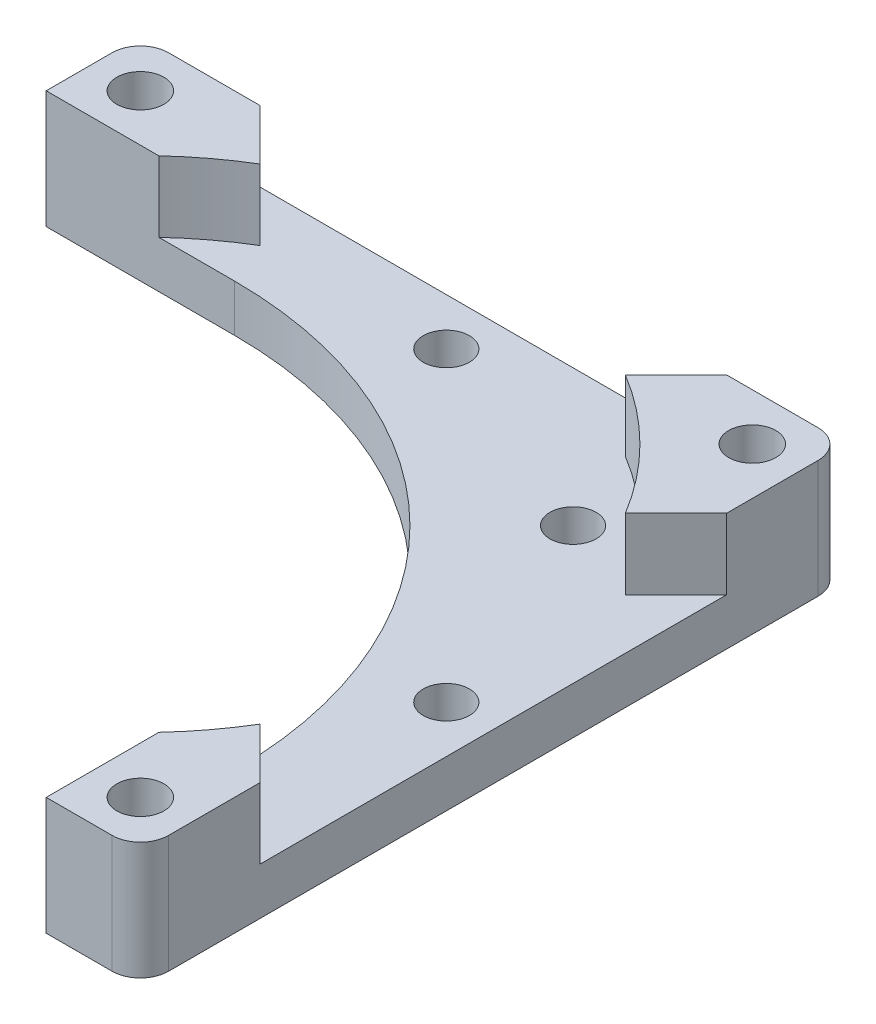
ISO-10303-21;
HEADER;
FILE_DESCRIPTION(('STEP AP214'),'2;1');
FILE_NAME('part.step','',(''),(''),'','','');
FILE_SCHEMA(('AUTOMOTIVE_DESIGN { 1 0 10303 214 1 1 1 1 }'));
ENDSEC;
DATA;
#1=APPLICATION_CONTEXT('core data for automotive mechanical design processes');
#2=APPLICATION_PROTOCOL_DEFINITION('international standard','automotive_design',2000,#1);
#3=PRODUCT_CONTEXT('',#1,'mechanical');
#4=PRODUCT('Part','Part','',(#3));
#5=PRODUCT_RELATED_PRODUCT_CATEGORY('part','',(#4));
#6=PRODUCT_DEFINITION_FORMATION('','',#4);
#7=PRODUCT_DEFINITION_CONTEXT('part definition',#1,'design');
#8=PRODUCT_DEFINITION('design','',#6,#7);
#9=PRODUCT_DEFINITION_SHAPE('','',#8);
#10=(LENGTH_UNIT() NAMED_UNIT(*) SI_UNIT(.MILLI.,.METRE.));
#11=(NAMED_UNIT(*) PLANE_ANGLE_UNIT() SI_UNIT($,.RADIAN.));
#12=(NAMED_UNIT(*) SI_UNIT($,.STERADIAN.) SOLID_ANGLE_UNIT());
#13=UNCERTAINTY_MEASURE_WITH_UNIT(LENGTH_MEASURE(1.E-05),#10,'distance_accuracy_value','');
#14=(GEOMETRIC_REPRESENTATION_CONTEXT(3) GLOBAL_UNCERTAINTY_ASSIGNED_CONTEXT((#13)) GLOBAL_UNIT_ASSIGNED_CONTEXT((#10,
#11,#12)) REPRESENTATION_CONTEXT('',''));
#15=CARTESIAN_POINT('',(0.,0.,0.));
#16=DIRECTION('',(0.,0.,1.));
#17=DIRECTION('',(1.,0.,0.));
#18=AXIS2_PLACEMENT_3D('',#15,#16,#17);
#19=CARTESIAN_POINT('',(0.,12.7,0.));
#20=DIRECTION('',(0.,-1.,0.));
#21=DIRECTION('',(0.,0.,-1.));
#22=AXIS2_PLACEMENT_3D('',#19,#20,#21);
#23=PLANE('',#22);
#24=CARTESIAN_POINT('',(58.3716647869505,12.7,-58.371664786952));
#25=DIRECTION('',(0.,1.,0.));
#26=DIRECTION('',(0.,0.,1.));
#27=AXIS2_PLACEMENT_3D('',#24,#25,#26);
#28=CIRCLE('',#27,6.22300000000001);
#29=CARTESIAN_POINT('',(58.3716647869505,12.7,-52.148664786952));
#30=VERTEX_POINT('',#29);
#31=EDGE_CURVE('E310',#30,#30,#28,.T.);
#32=ORIENTED_EDGE('',*,*,#31,.F.);
#33=EDGE_LOOP('',(#32));
#34=FACE_BOUND('',#33,.T.);
#35=CARTESIAN_POINT('',(82.5500000000035,12.7,-3.50920871089281E-12));
#36=DIRECTION('',(0.,1.,0.));
#37=DIRECTION('',(0.,0.,1.));
#38=AXIS2_PLACEMENT_3D('',#35,#36,#37);
#39=CIRCLE('',#38,6.22300000000001);
#40=CARTESIAN_POINT('',(82.5500000000035,12.7,6.2229999999965));
#41=VERTEX_POINT('',#40);
#42=EDGE_CURVE('E315',#41,#41,#39,.T.);
#43=ORIENTED_EDGE('',*,*,#42,.F.);
#44=EDGE_LOOP('',(#43));
#45=FACE_BOUND('',#44,.T.);
#46=CARTESIAN_POINT('',(0.,12.7,-82.55));
#47=DIRECTION('',(0.,1.,0.));
#48=DIRECTION('',(0.,0.,1.));
#49=AXIS2_PLACEMENT_3D('',#46,#47,#48);
#50=CIRCLE('',#49,6.223);
#51=CARTESIAN_POINT('',(0.,12.7,-76.327));
#52=VERTEX_POINT('',#51);
#53=EDGE_CURVE('E311',#52,#52,#50,.T.);
#54=ORIENTED_EDGE('',*,*,#53,.F.);
#55=EDGE_LOOP('',(#54));
#56=FACE_BOUND('',#55,.T.);
#57=DIRECTION('',(1.,0.,0.));
#58=VECTOR('',#57,1.);
#59=CARTESIAN_POINT('',(0.,12.7,-69.8500000000001));
#60=LINE('',#59,#58);
#61=CARTESIAN_POINT('',(-64.8509119615907,12.7,-69.85));
#62=VERTEX_POINT('',#61);
#63=CARTESIAN_POINT('',(-44.45,12.7,-69.85));
#64=VERTEX_POINT('',#63);
#65=EDGE_CURVE('E273',#62,#64,#60,.T.);
#66=ORIENTED_EDGE('',*,*,#65,.T.);
#67=CARTESIAN_POINT('',(-44.45,12.7,44.45));
#68=DIRECTION('',(0.,-1.,0.));
#69=DIRECTION('',(0.,0.,-1.));
#70=AXIS2_PLACEMENT_3D('',#67,#68,#69);
#71=CIRCLE('',#70,114.3);
#72=CARTESIAN_POINT('',(69.85,12.7,44.45));
#73=VERTEX_POINT('',#72);
#74=EDGE_CURVE('E242',#64,#73,#71,.T.);
#75=ORIENTED_EDGE('',*,*,#74,.T.);
#76=DIRECTION('',(0.,0.,1.));
#77=VECTOR('',#76,1.);
#78=CARTESIAN_POINT('',(69.85,12.7,0.));
#79=LINE('',#78,#77);
#80=CARTESIAN_POINT('',(69.85,12.7,64.8509119615908));
#81=VERTEX_POINT('',#80);
#82=EDGE_CURVE('E277',#73,#81,#79,.T.);
#83=ORIENTED_EDGE('',*,*,#82,.T.);
#84=CARTESIAN_POINT('',(0.,12.7,0.));
#85=DIRECTION('',(0.,1.,0.));
#86=DIRECTION('',(-1.,0.,0.));
#87=AXIS2_PLACEMENT_3D('',#84,#85,#86);
#88=CIRCLE('',#87,95.3135);
#89=CARTESIAN_POINT('',(81.5941319717431,12.7,49.2652099358946));
#90=VERTEX_POINT('',#89);
#91=EDGE_CURVE('E343',#81,#90,#88,.T.);
#92=ORIENTED_EDGE('',*,*,#91,.T.);
#93=DIRECTION('',(-0.707106781186545,0.,-0.70710678118655));
#94=VECTOR('',#93,1.);
#95=CARTESIAN_POINT('',(16.1644610179245,12.7,-16.1644610179244));
#96=LINE('',#95,#94);
#97=CARTESIAN_POINT('',(95.25,12.7,62.9210779641516));
#98=VERTEX_POINT('',#97);
#99=EDGE_CURVE('E347',#98,#90,#96,.T.);
#100=ORIENTED_EDGE('',*,*,#99,.F.);
#101=DIRECTION('',(0.,0.,-1.));
#102=VECTOR('',#101,1.);
#103=CARTESIAN_POINT('',(95.25,12.7,95.25));
#104=LINE('',#103,#102);
#105=CARTESIAN_POINT('',(95.25,12.7,-62.9210779641511));
#106=VERTEX_POINT('',#105);
#107=EDGE_CURVE('E402',#98,#106,#104,.T.);
#108=ORIENTED_EDGE('',*,*,#107,.T.);
#109=DIRECTION('',(0.707106781186547,0.,-0.707106781186548));
#110=VECTOR('',#109,1.);
#111=CARTESIAN_POINT('',(16.1644610179246,12.7,16.1644610179246));
#112=LINE('',#111,#110);
#113=CARTESIAN_POINT('',(81.5941319717433,12.7,-49.2652099358943));
#114=VERTEX_POINT('',#113);
#115=EDGE_CURVE('E385',#114,#106,#112,.T.);
#116=ORIENTED_EDGE('',*,*,#115,.F.);
#117=CARTESIAN_POINT('',(0.,12.7,0.));
#118=DIRECTION('',(0.,1.,0.));
#119=DIRECTION('',(0.,0.,1.));
#120=AXIS2_PLACEMENT_3D('',#117,#118,#119);
#121=CIRCLE('',#120,95.3135);
#122=CARTESIAN_POINT('',(49.2652099358943,12.7,-81.5941319717433));
#123=VERTEX_POINT('',#122);
#124=EDGE_CURVE('E366',#114,#123,#121,.T.);
#125=ORIENTED_EDGE('',*,*,#124,.T.);
#126=DIRECTION('',(-0.707106781186547,0.,0.707106781186548));
#127=VECTOR('',#126,1.);
#128=CARTESIAN_POINT('',(-16.1644610179244,12.7,-16.1644610179244));
#129=LINE('',#128,#127);
#130=CARTESIAN_POINT('',(62.9210779641511,12.7,-95.25));
#131=VERTEX_POINT('',#130);
#132=EDGE_CURVE('E371',#131,#123,#129,.T.);
#133=ORIENTED_EDGE('',*,*,#132,.F.);
#134=DIRECTION('',(-1.,0.,0.));
#135=VECTOR('',#134,1.);
#136=CARTESIAN_POINT('',(-95.25,12.7,-95.25));
#137=LINE('',#136,#135);
#138=CARTESIAN_POINT('',(-62.9210779641501,12.7,-95.25));
#139=VERTEX_POINT('',#138);
#140=EDGE_CURVE('E122',#131,#139,#137,.T.);
#141=ORIENTED_EDGE('',*,*,#140,.T.);
#142=DIRECTION('',(-0.707106781186541,0.,-0.707106781186554));
#143=VECTOR('',#142,1.);
#144=CARTESIAN_POINT('',(16.1644610179247,12.7,-16.1644610179244));
#145=LINE('',#144,#143);
#146=CARTESIAN_POINT('',(-49.2652099358934,12.7,-81.5941319717438));
#147=VERTEX_POINT('',#146);
#148=EDGE_CURVE('E117',#147,#139,#145,.T.);
#149=ORIENTED_EDGE('',*,*,#148,.F.);
#150=CARTESIAN_POINT('',(0.,12.7,0.));
#151=DIRECTION('',(0.,1.,0.));
#152=DIRECTION('',(1.,0.,0.));
#153=AXIS2_PLACEMENT_3D('',#150,#151,#152);
#154=CIRCLE('',#153,95.3135);
#155=EDGE_CURVE('E335',#147,#62,#154,.T.);
#156=ORIENTED_EDGE('',*,*,#155,.T.);
#157=EDGE_LOOP('',(#66,#75,#83,#92,#100,#108,#116,#125,#133,#141,#149,#156));
#158=FACE_BOUND('',#157,.T.);
#159=ADVANCED_FACE('F102',(#34,#45,#56,#158),#23,.F.);
#160=CARTESIAN_POINT('',(-95.25,12.7,95.25));
#161=DIRECTION('',(1.,0.,0.));
#162=DIRECTION('',(0.,0.,-1.));
#163=AXIS2_PLACEMENT_3D('',#160,#161,#162);
#164=PLANE('',#163);
#165=DIRECTION('',(0.,0.,1.));
#166=VECTOR('',#165,1.);
#167=CARTESIAN_POINT('',(-95.25,0.,95.25));
#168=LINE('',#167,#166);
#169=CARTESIAN_POINT('',(-95.25,0.,-87.63));
#170=VERTEX_POINT('',#169);
#171=CARTESIAN_POINT('',(-95.2499999999991,0.,-69.85));
#172=VERTEX_POINT('',#171);
#173=EDGE_CURVE('E412',#170,#172,#168,.T.);
#174=ORIENTED_EDGE('',*,*,#173,.T.);
#175=DIRECTION('',(0.,1.,0.));
#176=VECTOR('',#175,1.);
#177=CARTESIAN_POINT('',(-95.2499999999991,0.,-69.85));
#178=LINE('',#177,#176);
#179=CARTESIAN_POINT('',(-95.2499999999991,31.75,-69.85));
#180=VERTEX_POINT('',#179);
#181=EDGE_CURVE('E246',#172,#180,#178,.T.);
#182=ORIENTED_EDGE('',*,*,#181,.T.);
#183=DIRECTION('',(0.,0.,1.));
#184=VECTOR('',#183,1.);
#185=CARTESIAN_POINT('',(-95.25,31.75,-9.97690792574426E-13));
#186=LINE('',#185,#184);
#187=CARTESIAN_POINT('',(-95.2499999999991,31.75,-87.630000000001));
#188=VERTEX_POINT('',#187);
#189=EDGE_CURVE('E331',#188,#180,#186,.T.);
#190=ORIENTED_EDGE('',*,*,#189,.F.);
#191=DIRECTION('',(0.,-1.,0.));
#192=VECTOR('',#191,1.);
#193=CARTESIAN_POINT('',(-95.25,12.7,-87.63));
#194=LINE('',#193,#192);
#195=EDGE_CURVE('E431',#188,#170,#194,.T.);
#196=ORIENTED_EDGE('',*,*,#195,.T.);
#197=EDGE_LOOP('',(#174,#182,#190,#196));
#198=FACE_BOUND('',#197,.T.);
#199=ADVANCED_FACE('F470',(#198),#164,.F.);
#200=CARTESIAN_POINT('',(-95.25,12.7,95.25));
#201=DIRECTION('',(0.,0.,-1.));
#202=DIRECTION('',(-1.,0.,0.));
#203=AXIS2_PLACEMENT_3D('',#200,#201,#202);
#204=PLANE('',#203);
#205=DIRECTION('',(1.,0.,0.));
#206=VECTOR('',#205,1.);
#207=CARTESIAN_POINT('',(-3.32563597524809E-13,31.75,95.25));
#208=LINE('',#207,#206);
#209=CARTESIAN_POINT('',(69.85,31.75,95.25));
#210=VERTEX_POINT('',#209);
#211=CARTESIAN_POINT('',(87.6299999999997,31.75,95.2500000000003));
#212=VERTEX_POINT('',#211);
#213=EDGE_CURVE('E346',#210,#212,#208,.T.);
#214=ORIENTED_EDGE('',*,*,#213,.F.);
#215=DIRECTION('',(0.,1.,0.));
#216=VECTOR('',#215,1.);
#217=CARTESIAN_POINT('',(69.85,0.,95.25));
#218=LINE('',#217,#216);
#219=CARTESIAN_POINT('',(69.85,0.,95.25));
#220=VERTEX_POINT('',#219);
#221=EDGE_CURVE('E262',#220,#210,#218,.T.);
#222=ORIENTED_EDGE('',*,*,#221,.F.);
#223=DIRECTION('',(1.,0.,0.));
#224=VECTOR('',#223,1.);
#225=CARTESIAN_POINT('',(-95.25,0.,95.25));
#226=LINE('',#225,#224);
#227=CARTESIAN_POINT('',(87.63,0.,95.25));
#228=VERTEX_POINT('',#227);
#229=EDGE_CURVE('E404',#220,#228,#226,.T.);
#230=ORIENTED_EDGE('',*,*,#229,.T.);
#231=DIRECTION('',(0.,-1.,0.));
#232=VECTOR('',#231,1.);
#233=CARTESIAN_POINT('',(87.63,12.7,95.25));
#234=LINE('',#233,#232);
#235=EDGE_CURVE('E110',#228,#212,#234,.F.);
#236=ORIENTED_EDGE('',*,*,#235,.T.);
#237=EDGE_LOOP('',(#214,#222,#230,#236));
#238=FACE_BOUND('',#237,.T.);
#239=ADVANCED_FACE('F476',(#238),#204,.F.);
#240=CARTESIAN_POINT('',(0.,0.,0.));
#241=DIRECTION('',(0.,-1.,0.));
#242=DIRECTION('',(0.,0.,-1.));
#243=AXIS2_PLACEMENT_3D('',#240,#241,#242);
#244=PLANE('',#243);
#245=CARTESIAN_POINT('',(-44.45,0.,44.45));
#246=DIRECTION('',(0.,1.,0.));
#247=DIRECTION('',(0.,0.,-1.));
#248=AXIS2_PLACEMENT_3D('',#245,#246,#247);
#249=CIRCLE('',#248,114.3);
#250=CARTESIAN_POINT('',(69.85,0.,44.45));
#251=VERTEX_POINT('',#250);
#252=CARTESIAN_POINT('',(-44.45,0.,-69.85));
#253=VERTEX_POINT('',#252);
#254=EDGE_CURVE('E239',#251,#253,#249,.T.);
#255=ORIENTED_EDGE('',*,*,#254,.T.);
#256=DIRECTION('',(-1.,0.,0.));
#257=VECTOR('',#256,1.);
#258=CARTESIAN_POINT('',(-95.2499999999991,0.,-69.85));
#259=LINE('',#258,#257);
#260=EDGE_CURVE('E255',#253,#172,#259,.T.);
#261=ORIENTED_EDGE('',*,*,#260,.T.);
#262=ORIENTED_EDGE('',*,*,#173,.F.);
#263=CARTESIAN_POINT('',(-87.63,0.,-87.63));
#264=DIRECTION('',(0.,-1.,0.));
#265=DIRECTION('',(0.,0.,-1.));
#266=AXIS2_PLACEMENT_3D('',#263,#264,#265);
#267=CIRCLE('',#266,7.62);
#268=CARTESIAN_POINT('',(-87.63,0.,-95.25));
#269=VERTEX_POINT('',#268);
#270=EDGE_CURVE('E422',#170,#269,#267,.T.);
#271=ORIENTED_EDGE('',*,*,#270,.T.);
#272=DIRECTION('',(-1.,0.,0.));
#273=VECTOR('',#272,1.);
#274=CARTESIAN_POINT('',(-95.25,0.,-95.25));
#275=LINE('',#274,#273);
#276=CARTESIAN_POINT('',(87.63,0.,-95.25));
#277=VERTEX_POINT('',#276);
#278=EDGE_CURVE('E409',#277,#269,#275,.T.);
#279=ORIENTED_EDGE('',*,*,#278,.F.);
#280=CARTESIAN_POINT('',(87.63,0.,-87.63));
#281=DIRECTION('',(0.,-1.,0.));
#282=DIRECTION('',(0.,0.,-1.));
#283=AXIS2_PLACEMENT_3D('',#280,#281,#282);
#284=CIRCLE('',#283,7.62);
#285=CARTESIAN_POINT('',(95.25,0.,-87.63));
#286=VERTEX_POINT('',#285);
#287=EDGE_CURVE('E424',#277,#286,#284,.T.);
#288=ORIENTED_EDGE('',*,*,#287,.T.);
#289=DIRECTION('',(0.,0.,-1.));
#290=VECTOR('',#289,1.);
#291=CARTESIAN_POINT('',(95.25,0.,95.25));
#292=LINE('',#291,#290);
#293=CARTESIAN_POINT('',(95.25,0.,87.63));
#294=VERTEX_POINT('',#293);
#295=EDGE_CURVE('E401',#294,#286,#292,.T.);
#296=ORIENTED_EDGE('',*,*,#295,.F.);
#297=CARTESIAN_POINT('',(87.63,0.,87.63));
#298=DIRECTION('',(0.,-1.,0.));
#299=DIRECTION('',(0.,0.,-1.));
#300=AXIS2_PLACEMENT_3D('',#297,#298,#299);
#301=CIRCLE('',#300,7.62);
#302=EDGE_CURVE('E419',#294,#228,#301,.T.);
#303=ORIENTED_EDGE('',*,*,#302,.T.);
#304=ORIENTED_EDGE('',*,*,#229,.F.);
#305=DIRECTION('',(0.,0.,-1.));
#306=VECTOR('',#305,1.);
#307=CARTESIAN_POINT('',(69.85,0.,95.25));
#308=LINE('',#307,#306);
#309=EDGE_CURVE('E258',#220,#251,#308,.T.);
#310=ORIENTED_EDGE('',*,*,#309,.T.);
#311=EDGE_LOOP('',(#255,#261,#262,#271,#279,#288,#296,#303,#304,#310));
#312=FACE_BOUND('',#311,.T.);
#313=CARTESIAN_POINT('',(82.5499999999997,0.,82.5500000000003));
#314=DIRECTION('',(0.,1.,0.));
#315=DIRECTION('',(-1.,0.,0.));
#316=AXIS2_PLACEMENT_3D('',#313,#314,#315);
#317=CIRCLE('',#316,3.2385);
#318=CARTESIAN_POINT('',(79.3114999999997,0.,82.5500000000003));
#319=VERTEX_POINT('',#318);
#320=EDGE_CURVE('E281',#319,#319,#317,.T.);
#321=ORIENTED_EDGE('',*,*,#320,.T.);
#322=EDGE_LOOP('',(#321));
#323=FACE_BOUND('',#322,.T.);
#324=CARTESIAN_POINT('',(-82.5499999999992,0.,-82.5500000000009));
#325=DIRECTION('',(0.,1.,0.));
#326=DIRECTION('',(1.,0.,0.));
#327=AXIS2_PLACEMENT_3D('',#324,#325,#326);
#328=CIRCLE('',#327,3.2385);
#329=CARTESIAN_POINT('',(-79.3114999999991,0.,-82.5500000000009));
#330=VERTEX_POINT('',#329);
#331=EDGE_CURVE('E280',#330,#330,#328,.T.);
#332=ORIENTED_EDGE('',*,*,#331,.T.);
#333=EDGE_LOOP('',(#332));
#334=FACE_BOUND('',#333,.T.);
#335=CARTESIAN_POINT('',(82.55,0.,-82.55));
#336=DIRECTION('',(0.,1.,0.));
#337=DIRECTION('',(0.,0.,1.));
#338=AXIS2_PLACEMENT_3D('',#335,#336,#337);
#339=CIRCLE('',#338,3.2385);
#340=CARTESIAN_POINT('',(82.55,0.,-79.3115));
#341=VERTEX_POINT('',#340);
#342=EDGE_CURVE('E294',#341,#341,#339,.T.);
#343=ORIENTED_EDGE('',*,*,#342,.T.);
#344=EDGE_LOOP('',(#343));
#345=FACE_BOUND('',#344,.T.);
#346=CARTESIAN_POINT('',(58.3716647869505,0.,-58.371664786952));
#347=DIRECTION('',(0.,-1.,0.));
#348=DIRECTION('',(0.,0.,-1.));
#349=AXIS2_PLACEMENT_3D('',#346,#347,#348);
#350=CIRCLE('',#349,6.22300000000001);
#351=CARTESIAN_POINT('',(58.3716647869505,0.,-64.594664786952));
#352=VERTEX_POINT('',#351);
#353=EDGE_CURVE('E314',#352,#352,#350,.T.);
#354=ORIENTED_EDGE('',*,*,#353,.F.);
#355=EDGE_LOOP('',(#354));
#356=FACE_BOUND('',#355,.T.);
#357=CARTESIAN_POINT('',(82.5500000000035,0.,-3.50920871089281E-12));
#358=DIRECTION('',(0.,-1.,0.));
#359=DIRECTION('',(0.,0.,-1.));
#360=AXIS2_PLACEMENT_3D('',#357,#358,#359);
#361=CIRCLE('',#360,6.22300000000001);
#362=CARTESIAN_POINT('',(82.5500000000035,0.,-6.22300000000352));
#363=VERTEX_POINT('',#362);
#364=EDGE_CURVE('E438',#363,#363,#361,.T.);
#365=ORIENTED_EDGE('',*,*,#364,.F.);
#366=EDGE_LOOP('',(#365));
#367=FACE_BOUND('',#366,.T.);
#368=CARTESIAN_POINT('',(0.,0.,-82.55));
#369=DIRECTION('',(0.,-1.,0.));
#370=DIRECTION('',(0.,0.,-1.));
#371=AXIS2_PLACEMENT_3D('',#368,#369,#370);
#372=CIRCLE('',#371,6.223);
#373=CARTESIAN_POINT('',(0.,0.,-88.773));
#374=VERTEX_POINT('',#373);
#375=EDGE_CURVE('E337',#374,#374,#372,.T.);
#376=ORIENTED_EDGE('',*,*,#375,.F.);
#377=EDGE_LOOP('',(#376));
#378=FACE_BOUND('',#377,.T.);
#379=ADVANCED_FACE('F252',(#312,#323,#334,#345,#356,#367,#378),#244,.T.);
#380=CARTESIAN_POINT('',(95.25,12.7,95.25));
#381=DIRECTION('',(-1.,0.,0.));
#382=DIRECTION('',(0.,0.,1.));
#383=AXIS2_PLACEMENT_3D('',#380,#381,#382);
#384=PLANE('',#383);
#385=ORIENTED_EDGE('',*,*,#295,.T.);
#386=DIRECTION('',(0.,-1.,0.));
#387=VECTOR('',#386,1.);
#388=CARTESIAN_POINT('',(95.25,12.7,-87.63));
#389=LINE('',#388,#387);
#390=CARTESIAN_POINT('',(95.25,31.75,-87.63));
#391=VERTEX_POINT('',#390);
#392=EDGE_CURVE('E429',#286,#391,#389,.F.);
#393=ORIENTED_EDGE('',*,*,#392,.T.);
#394=DIRECTION('',(0.,0.,-1.));
#395=VECTOR('',#394,1.);
#396=CARTESIAN_POINT('',(95.25,31.75,0.));
#397=LINE('',#396,#395);
#398=CARTESIAN_POINT('',(95.25,31.75,-62.9210779641511));
#399=VERTEX_POINT('',#398);
#400=EDGE_CURVE('E373',#399,#391,#397,.T.);
#401=ORIENTED_EDGE('',*,*,#400,.F.);
#402=DIRECTION('',(0.,-1.,0.));
#403=VECTOR('',#402,1.);
#404=CARTESIAN_POINT('',(95.25,31.75,-62.9210779641511));
#405=LINE('',#404,#403);
#406=EDGE_CURVE('E395',#399,#106,#405,.T.);
#407=ORIENTED_EDGE('',*,*,#406,.T.);
#408=ORIENTED_EDGE('',*,*,#107,.F.);
#409=DIRECTION('',(0.,-1.,0.));
#410=VECTOR('',#409,1.);
#411=CARTESIAN_POINT('',(95.2499999999998,31.75,62.9210779641514));
#412=LINE('',#411,#410);
#413=CARTESIAN_POINT('',(95.2499999999998,31.75,62.9210779641514));
#414=VERTEX_POINT('',#413);
#415=EDGE_CURVE('E363',#414,#98,#412,.T.);
#416=ORIENTED_EDGE('',*,*,#415,.F.);
#417=DIRECTION('',(0.,0.,-1.));
#418=VECTOR('',#417,1.);
#419=CARTESIAN_POINT('',(95.25,31.75,3.32563597524808E-13));
#420=LINE('',#419,#418);
#421=CARTESIAN_POINT('',(95.2499999999997,31.75,87.6300000000004));
#422=VERTEX_POINT('',#421);
#423=EDGE_CURVE('E352',#422,#414,#420,.T.);
#424=ORIENTED_EDGE('',*,*,#423,.F.);
#425=DIRECTION('',(0.,-1.,0.));
#426=VECTOR('',#425,1.);
#427=CARTESIAN_POINT('',(95.25,12.7,87.63));
#428=LINE('',#427,#426);
#429=EDGE_CURVE('E426',#422,#294,#428,.T.);
#430=ORIENTED_EDGE('',*,*,#429,.T.);
#431=EDGE_LOOP('',(#385,#393,#401,#407,#408,#416,#424,#430));
#432=FACE_BOUND('',#431,.T.);
#433=ADVANCED_FACE('F487',(#432),#384,.F.);
#434=CARTESIAN_POINT('',(-95.25,12.7,-95.25));
#435=DIRECTION('',(0.,0.,1.));
#436=DIRECTION('',(1.,0.,0.));
#437=AXIS2_PLACEMENT_3D('',#434,#435,#436);
#438=PLANE('',#437);
#439=ORIENTED_EDGE('',*,*,#140,.F.);
#440=DIRECTION('',(0.,-1.,0.));
#441=VECTOR('',#440,1.);
#442=CARTESIAN_POINT('',(62.9210779641511,31.75,-95.25));
#443=LINE('',#442,#441);
#444=CARTESIAN_POINT('',(62.9210779641511,31.75,-95.25));
#445=VERTEX_POINT('',#444);
#446=EDGE_CURVE('E392',#445,#131,#443,.T.);
#447=ORIENTED_EDGE('',*,*,#446,.F.);
#448=DIRECTION('',(-1.,0.,0.));
#449=VECTOR('',#448,1.);
#450=CARTESIAN_POINT('',(0.,31.75,-95.25));
#451=LINE('',#450,#449);
#452=CARTESIAN_POINT('',(87.63,31.75,-95.25));
#453=VERTEX_POINT('',#452);
#454=EDGE_CURVE('E379',#453,#445,#451,.T.);
#455=ORIENTED_EDGE('',*,*,#454,.F.);
#456=DIRECTION('',(0.,-1.,0.));
#457=VECTOR('',#456,1.);
#458=CARTESIAN_POINT('',(87.63,12.7,-95.25));
#459=LINE('',#458,#457);
#460=EDGE_CURVE('E416',#453,#277,#459,.T.);
#461=ORIENTED_EDGE('',*,*,#460,.T.);
#462=ORIENTED_EDGE('',*,*,#278,.T.);
#463=DIRECTION('',(0.,-1.,0.));
#464=VECTOR('',#463,1.);
#465=CARTESIAN_POINT('',(-87.63,12.7,-95.25));
#466=LINE('',#465,#464);
#467=CARTESIAN_POINT('',(-87.629999999999,31.75,-95.2500000000009));
#468=VERTEX_POINT('',#467);
#469=EDGE_CURVE('E406',#269,#468,#466,.F.);
#470=ORIENTED_EDGE('',*,*,#469,.T.);
#471=DIRECTION('',(-1.,0.,0.));
#472=VECTOR('',#471,1.);
#473=CARTESIAN_POINT('',(9.97690792574426E-13,31.75,-95.25));
#474=LINE('',#473,#472);
#475=CARTESIAN_POINT('',(-62.9210779641501,31.75,-95.2500000000007));
#476=VERTEX_POINT('',#475);
#477=EDGE_CURVE('E325',#476,#468,#474,.T.);
#478=ORIENTED_EDGE('',*,*,#477,.F.);
#479=DIRECTION('',(0.,-1.,0.));
#480=VECTOR('',#479,1.);
#481=CARTESIAN_POINT('',(-62.9210779641501,31.75,-95.2500000000007));
#482=LINE('',#481,#480);
#483=EDGE_CURVE('E334',#476,#139,#482,.T.);
#484=ORIENTED_EDGE('',*,*,#483,.T.);
#485=EDGE_LOOP('',(#439,#447,#455,#461,#462,#470,#478,#484));
#486=FACE_BOUND('',#485,.T.);
#487=ADVANCED_FACE('F491',(#486),#438,.F.);
#488=CARTESIAN_POINT('',(87.63,12.7,-87.63));
#489=DIRECTION('',(0.,-1.,0.));
#490=DIRECTION('',(0.,0.,-1.));
#491=AXIS2_PLACEMENT_3D('',#488,#489,#490);
#492=CYLINDRICAL_SURFACE('',#491,7.62);
#493=ORIENTED_EDGE('',*,*,#460,.F.);
#494=CARTESIAN_POINT('',(87.63,31.75,-87.63));
#495=DIRECTION('',(0.,1.,0.));
#496=DIRECTION('',(0.,0.,1.));
#497=AXIS2_PLACEMENT_3D('',#494,#495,#496);
#498=CIRCLE('',#497,7.62);
#499=EDGE_CURVE('E376',#391,#453,#498,.T.);
#500=ORIENTED_EDGE('',*,*,#499,.F.);
#501=ORIENTED_EDGE('',*,*,#392,.F.);
#502=ORIENTED_EDGE('',*,*,#287,.F.);
#503=EDGE_LOOP('',(#493,#500,#501,#502));
#504=FACE_BOUND('',#503,.T.);
#505=ADVANCED_FACE('F494',(#504),#492,.T.);
#506=CARTESIAN_POINT('',(-87.63,12.7,-87.63));
#507=DIRECTION('',(0.,-1.,0.));
#508=DIRECTION('',(0.,0.,-1.));
#509=AXIS2_PLACEMENT_3D('',#506,#507,#508);
#510=CYLINDRICAL_SURFACE('',#509,7.62);
#511=ORIENTED_EDGE('',*,*,#195,.F.);
#512=CARTESIAN_POINT('',(-87.6299999999991,31.75,-87.6300000000009));
#513=DIRECTION('',(0.,1.,0.));
#514=DIRECTION('',(1.,0.,0.));
#515=AXIS2_PLACEMENT_3D('',#512,#513,#514);
#516=CIRCLE('',#515,7.62);
#517=EDGE_CURVE('E328',#468,#188,#516,.T.);
#518=ORIENTED_EDGE('',*,*,#517,.F.);
#519=ORIENTED_EDGE('',*,*,#469,.F.);
#520=ORIENTED_EDGE('',*,*,#270,.F.);
#521=EDGE_LOOP('',(#511,#518,#519,#520));
#522=FACE_BOUND('',#521,.T.);
#523=ADVANCED_FACE('F500',(#522),#510,.T.);
#524=CARTESIAN_POINT('',(87.63,12.7,87.63));
#525=DIRECTION('',(0.,-1.,0.));
#526=DIRECTION('',(0.,0.,-1.));
#527=AXIS2_PLACEMENT_3D('',#524,#525,#526);
#528=CYLINDRICAL_SURFACE('',#527,7.62);
#529=ORIENTED_EDGE('',*,*,#429,.F.);
#530=CARTESIAN_POINT('',(87.6299999999997,31.75,87.6300000000003));
#531=DIRECTION('',(0.,1.,0.));
#532=DIRECTION('',(-1.,0.,0.));
#533=AXIS2_PLACEMENT_3D('',#530,#531,#532);
#534=CIRCLE('',#533,7.62);
#535=EDGE_CURVE('E349',#212,#422,#534,.T.);
#536=ORIENTED_EDGE('',*,*,#535,.F.);
#537=ORIENTED_EDGE('',*,*,#235,.F.);
#538=ORIENTED_EDGE('',*,*,#302,.F.);
#539=EDGE_LOOP('',(#529,#536,#537,#538));
#540=FACE_BOUND('',#539,.T.);
#541=ADVANCED_FACE('F104',(#540),#528,.T.);
#542=CARTESIAN_POINT('',(0.,31.75,0.));
#543=DIRECTION('',(0.,-1.,0.));
#544=DIRECTION('',(0.,0.,-1.));
#545=AXIS2_PLACEMENT_3D('',#542,#543,#544);
#546=CYLINDRICAL_SURFACE('',#545,95.3135);
#547=ORIENTED_EDGE('',*,*,#124,.F.);
#548=DIRECTION('',(0.,-1.,0.));
#549=VECTOR('',#548,1.);
#550=CARTESIAN_POINT('',(81.5941319717433,31.75,-49.2652099358943));
#551=LINE('',#550,#549);
#552=CARTESIAN_POINT('',(81.5941319717433,31.75,-49.2652099358943));
#553=VERTEX_POINT('',#552);
#554=EDGE_CURVE('E398',#553,#114,#551,.T.);
#555=ORIENTED_EDGE('',*,*,#554,.F.);
#556=CARTESIAN_POINT('',(0.,31.75,0.));
#557=DIRECTION('',(0.,1.,0.));
#558=DIRECTION('',(0.,0.,1.));
#559=AXIS2_PLACEMENT_3D('',#556,#557,#558);
#560=CIRCLE('',#559,95.3135);
#561=CARTESIAN_POINT('',(49.2652099358943,31.75,-81.5941319717433));
#562=VERTEX_POINT('',#561);
#563=EDGE_CURVE('E367',#553,#562,#560,.T.);
#564=ORIENTED_EDGE('',*,*,#563,.T.);
#565=DIRECTION('',(0.,-1.,0.));
#566=VECTOR('',#565,1.);
#567=CARTESIAN_POINT('',(49.2652099358943,31.75,-81.5941319717433));
#568=LINE('',#567,#566);
#569=EDGE_CURVE('E383',#562,#123,#568,.T.);
#570=ORIENTED_EDGE('',*,*,#569,.T.);
#571=EDGE_LOOP('',(#547,#555,#564,#570));
#572=FACE_BOUND('',#571,.T.);
#573=ADVANCED_FACE('F483',(#572),#546,.F.);
#574=CARTESIAN_POINT('',(16.1644610179246,31.75,16.1644610179246));
#575=DIRECTION('',(-0.707106781186548,0.,-0.707106781186547));
#576=DIRECTION('',(-0.707106781186547,0.,0.707106781186548));
#577=AXIS2_PLACEMENT_3D('',#574,#575,#576);
#578=PLANE('',#577);
#579=ORIENTED_EDGE('',*,*,#115,.T.);
#580=ORIENTED_EDGE('',*,*,#406,.F.);
#581=DIRECTION('',(0.707106781186547,0.,-0.707106781186548));
#582=VECTOR('',#581,1.);
#583=CARTESIAN_POINT('',(16.1644610179246,31.75,16.1644610179246));
#584=LINE('',#583,#582);
#585=EDGE_CURVE('E370',#553,#399,#584,.T.);
#586=ORIENTED_EDGE('',*,*,#585,.F.);
#587=ORIENTED_EDGE('',*,*,#554,.T.);
#588=EDGE_LOOP('',(#579,#580,#586,#587));
#589=FACE_BOUND('',#588,.T.);
#590=ADVANCED_FACE('F566',(#589),#578,.F.);
#591=CARTESIAN_POINT('',(-16.1644610179244,31.75,-16.1644610179244));
#592=DIRECTION('',(0.707106781186548,0.,0.707106781186547));
#593=DIRECTION('',(0.707106781186547,0.,-0.707106781186548));
#594=AXIS2_PLACEMENT_3D('',#591,#592,#593);
#595=PLANE('',#594);
#596=ORIENTED_EDGE('',*,*,#132,.T.);
#597=ORIENTED_EDGE('',*,*,#569,.F.);
#598=DIRECTION('',(-0.707106781186547,0.,0.707106781186548));
#599=VECTOR('',#598,1.);
#600=CARTESIAN_POINT('',(-16.1644610179244,31.75,-16.1644610179244));
#601=LINE('',#600,#599);
#602=EDGE_CURVE('E381',#445,#562,#601,.T.);
#603=ORIENTED_EDGE('',*,*,#602,.F.);
#604=ORIENTED_EDGE('',*,*,#446,.T.);
#605=EDGE_LOOP('',(#596,#597,#603,#604));
#606=FACE_BOUND('',#605,.T.);
#607=ADVANCED_FACE('F563',(#606),#595,.F.);
#608=CARTESIAN_POINT('',(0.,31.75,0.));
#609=DIRECTION('',(0.,1.,0.));
#610=DIRECTION('',(0.,0.,1.));
#611=AXIS2_PLACEMENT_3D('',#608,#609,#610);
#612=PLANE('',#611);
#613=CARTESIAN_POINT('',(82.55,31.75,-82.55));
#614=DIRECTION('',(0.,1.,0.));
#615=DIRECTION('',(0.,0.,1.));
#616=AXIS2_PLACEMENT_3D('',#613,#614,#615);
#617=CIRCLE('',#616,6.34999999999999);
#618=CARTESIAN_POINT('',(82.55,31.75,-76.2));
#619=VERTEX_POINT('',#618);
#620=EDGE_CURVE('E304',#619,#619,#617,.T.);
#621=ORIENTED_EDGE('',*,*,#620,.F.);
#622=EDGE_LOOP('',(#621));
#623=FACE_BOUND('',#622,.T.);
#624=ORIENTED_EDGE('',*,*,#563,.F.);
#625=ORIENTED_EDGE('',*,*,#585,.T.);
#626=ORIENTED_EDGE('',*,*,#400,.T.);
#627=ORIENTED_EDGE('',*,*,#499,.T.);
#628=ORIENTED_EDGE('',*,*,#454,.T.);
#629=ORIENTED_EDGE('',*,*,#602,.T.);
#630=EDGE_LOOP('',(#624,#625,#626,#627,#628,#629));
#631=FACE_BOUND('',#630,.T.);
#632=ADVANCED_FACE('F523',(#623,#631),#612,.T.);
#633=CARTESIAN_POINT('',(0.,31.75,0.));
#634=DIRECTION('',(0.,-1.,0.));
#635=DIRECTION('',(0.,0.,-1.));
#636=AXIS2_PLACEMENT_3D('',#633,#634,#635);
#637=CYLINDRICAL_SURFACE('',#636,95.3135);
#638=DIRECTION('',(0.,-1.,0.));
#639=VECTOR('',#638,1.);
#640=CARTESIAN_POINT('',(69.85,31.75,64.8509119615908));
#641=LINE('',#640,#639);
#642=CARTESIAN_POINT('',(69.85,31.75,64.8509119615908));
#643=VERTEX_POINT('',#642);
#644=EDGE_CURVE('E275',#643,#81,#641,.T.);
#645=ORIENTED_EDGE('',*,*,#644,.F.);
#646=CARTESIAN_POINT('',(0.,31.75,0.));
#647=DIRECTION('',(0.,1.,0.));
#648=DIRECTION('',(-1.,0.,0.));
#649=AXIS2_PLACEMENT_3D('',#646,#647,#648);
#650=CIRCLE('',#649,95.3135);
#651=CARTESIAN_POINT('',(81.5941319717431,31.75,49.2652099358946));
#652=VERTEX_POINT('',#651);
#653=EDGE_CURVE('E344',#643,#652,#650,.T.);
#654=ORIENTED_EDGE('',*,*,#653,.T.);
#655=DIRECTION('',(0.,-1.,0.));
#656=VECTOR('',#655,1.);
#657=CARTESIAN_POINT('',(81.5941319717431,31.75,49.2652099358946));
#658=LINE('',#657,#656);
#659=EDGE_CURVE('E357',#652,#90,#658,.T.);
#660=ORIENTED_EDGE('',*,*,#659,.T.);
#661=ORIENTED_EDGE('',*,*,#91,.F.);
#662=EDGE_LOOP('',(#645,#654,#660,#661));
#663=FACE_BOUND('',#662,.T.);
#664=ADVANCED_FACE('F544',(#663),#637,.F.);
#665=CARTESIAN_POINT('',(16.1644610179245,31.75,-16.1644610179244));
#666=DIRECTION('',(-0.70710678118655,0.,0.707106781186545));
#667=DIRECTION('',(0.707106781186545,0.,0.70710678118655));
#668=AXIS2_PLACEMENT_3D('',#665,#666,#667);
#669=PLANE('',#668);
#670=ORIENTED_EDGE('',*,*,#99,.T.);
#671=ORIENTED_EDGE('',*,*,#659,.F.);
#672=DIRECTION('',(-0.707106781186545,0.,-0.70710678118655));
#673=VECTOR('',#672,1.);
#674=CARTESIAN_POINT('',(16.1644610179245,31.75,-16.1644610179244));
#675=LINE('',#674,#673);
#676=EDGE_CURVE('E354',#414,#652,#675,.T.);
#677=ORIENTED_EDGE('',*,*,#676,.F.);
#678=ORIENTED_EDGE('',*,*,#415,.T.);
#679=EDGE_LOOP('',(#670,#671,#677,#678));
#680=FACE_BOUND('',#679,.T.);
#681=ADVANCED_FACE('F549',(#680),#669,.F.);
#682=CARTESIAN_POINT('',(0.,31.75,0.));
#683=DIRECTION('',(0.,1.,0.));
#684=DIRECTION('',(-1.,0.,0.));
#685=AXIS2_PLACEMENT_3D('',#682,#683,#684);
#686=PLANE('',#685);
#687=DIRECTION('',(0.,0.,-1.));
#688=VECTOR('',#687,1.);
#689=CARTESIAN_POINT('',(69.85,31.75,95.25));
#690=LINE('',#689,#688);
#691=EDGE_CURVE('E265',#210,#643,#690,.T.);
#692=ORIENTED_EDGE('',*,*,#691,.F.);
#693=ORIENTED_EDGE('',*,*,#213,.T.);
#694=ORIENTED_EDGE('',*,*,#535,.T.);
#695=ORIENTED_EDGE('',*,*,#423,.T.);
#696=ORIENTED_EDGE('',*,*,#676,.T.);
#697=ORIENTED_EDGE('',*,*,#653,.F.);
#698=EDGE_LOOP('',(#692,#693,#694,#695,#696,#697));
#699=FACE_BOUND('',#698,.T.);
#700=CARTESIAN_POINT('',(82.5499999999997,31.75,82.5500000000003));
#701=DIRECTION('',(0.,1.,0.));
#702=DIRECTION('',(-1.,0.,0.));
#703=AXIS2_PLACEMENT_3D('',#700,#701,#702);
#704=CIRCLE('',#703,6.34999999999999);
#705=CARTESIAN_POINT('',(76.1999999999997,31.75,82.5500000000003));
#706=VERTEX_POINT('',#705);
#707=EDGE_CURVE('E287',#706,#706,#704,.T.);
#708=ORIENTED_EDGE('',*,*,#707,.F.);
#709=EDGE_LOOP('',(#708));
#710=FACE_BOUND('',#709,.T.);
#711=ADVANCED_FACE('F538',(#699,#710),#686,.T.);
#712=CARTESIAN_POINT('',(0.,31.75,0.));
#713=DIRECTION('',(0.,-1.,0.));
#714=DIRECTION('',(0.,0.,-1.));
#715=AXIS2_PLACEMENT_3D('',#712,#713,#714);
#716=CYLINDRICAL_SURFACE('',#715,95.3135);
#717=DIRECTION('',(0.,-1.,0.));
#718=VECTOR('',#717,1.);
#719=CARTESIAN_POINT('',(-64.8509119615907,31.75,-69.85));
#720=LINE('',#719,#718);
#721=CARTESIAN_POINT('',(-64.8509119615908,31.75,-69.85));
#722=VERTEX_POINT('',#721);
#723=EDGE_CURVE('E269',#62,#722,#720,.F.);
#724=ORIENTED_EDGE('',*,*,#723,.F.);
#725=ORIENTED_EDGE('',*,*,#155,.F.);
#726=DIRECTION('',(0.,-1.,0.));
#727=VECTOR('',#726,1.);
#728=CARTESIAN_POINT('',(-49.2652099358935,31.75,-81.5941319717438));
#729=LINE('',#728,#727);
#730=CARTESIAN_POINT('',(-49.2652099358935,31.75,-81.5941319717438));
#731=VERTEX_POINT('',#730);
#732=EDGE_CURVE('E341',#731,#147,#729,.T.);
#733=ORIENTED_EDGE('',*,*,#732,.F.);
#734=CARTESIAN_POINT('',(0.,31.75,0.));
#735=DIRECTION('',(0.,1.,0.));
#736=DIRECTION('',(1.,0.,0.));
#737=AXIS2_PLACEMENT_3D('',#734,#735,#736);
#738=CIRCLE('',#737,95.3135);
#739=EDGE_CURVE('E320',#731,#722,#738,.T.);
#740=ORIENTED_EDGE('',*,*,#739,.T.);
#741=EDGE_LOOP('',(#724,#725,#733,#740));
#742=FACE_BOUND('',#741,.T.);
#743=ADVANCED_FACE('F556',(#742),#716,.F.);
#744=CARTESIAN_POINT('',(16.1644610179247,31.75,-16.1644610179244));
#745=DIRECTION('',(-0.707106781186554,0.,0.707106781186541));
#746=DIRECTION('',(0.707106781186541,0.,0.707106781186554));
#747=AXIS2_PLACEMENT_3D('',#744,#745,#746);
#748=PLANE('',#747);
#749=ORIENTED_EDGE('',*,*,#148,.T.);
#750=ORIENTED_EDGE('',*,*,#483,.F.);
#751=DIRECTION('',(-0.707106781186541,0.,-0.707106781186554));
#752=VECTOR('',#751,1.);
#753=CARTESIAN_POINT('',(16.1644610179247,31.75,-16.1644610179244));
#754=LINE('',#753,#752);
#755=EDGE_CURVE('E323',#731,#476,#754,.T.);
#756=ORIENTED_EDGE('',*,*,#755,.F.);
#757=ORIENTED_EDGE('',*,*,#732,.T.);
#758=EDGE_LOOP('',(#749,#750,#756,#757));
#759=FACE_BOUND('',#758,.T.);
#760=ADVANCED_FACE('F580',(#759),#748,.F.);
#761=CARTESIAN_POINT('',(0.,31.75,0.));
#762=DIRECTION('',(0.,1.,0.));
#763=DIRECTION('',(1.,0.,0.));
#764=AXIS2_PLACEMENT_3D('',#761,#762,#763);
#765=PLANE('',#764);
#766=DIRECTION('',(-1.,0.,0.));
#767=VECTOR('',#766,1.);
#768=CARTESIAN_POINT('',(0.,31.75,-69.8500000000001));
#769=LINE('',#768,#767);
#770=EDGE_CURVE('E12',#722,#180,#769,.T.);
#771=ORIENTED_EDGE('',*,*,#770,.F.);
#772=ORIENTED_EDGE('',*,*,#739,.F.);
#773=ORIENTED_EDGE('',*,*,#755,.T.);
#774=ORIENTED_EDGE('',*,*,#477,.T.);
#775=ORIENTED_EDGE('',*,*,#517,.T.);
#776=ORIENTED_EDGE('',*,*,#189,.T.);
#777=EDGE_LOOP('',(#771,#772,#773,#774,#775,#776));
#778=FACE_BOUND('',#777,.T.);
#779=CARTESIAN_POINT('',(-82.5499999999992,31.75,-82.5500000000009));
#780=DIRECTION('',(0.,1.,0.));
#781=DIRECTION('',(1.,0.,0.));
#782=AXIS2_PLACEMENT_3D('',#779,#780,#781);
#783=CIRCLE('',#782,6.34999999999999);
#784=CARTESIAN_POINT('',(-76.1999999999992,31.75,-82.5500000000008));
#785=VERTEX_POINT('',#784);
#786=EDGE_CURVE('E295',#785,#785,#783,.T.);
#787=ORIENTED_EDGE('',*,*,#786,.F.);
#788=EDGE_LOOP('',(#787));
#789=FACE_BOUND('',#788,.T.);
#790=ADVANCED_FACE('F513',(#778,#789),#765,.T.);
#791=CARTESIAN_POINT('',(58.3716647869505,-12.7,-58.371664786952));
#792=DIRECTION('',(0.,1.,0.));
#793=DIRECTION('',(0.,0.,1.));
#794=AXIS2_PLACEMENT_3D('',#791,#792,#793);
#795=CYLINDRICAL_SURFACE('',#794,6.22300000000001);
#796=ORIENTED_EDGE('',*,*,#353,.T.);
#797=EDGE_LOOP('',(#796));
#798=FACE_BOUND('',#797,.T.);
#799=ORIENTED_EDGE('',*,*,#31,.T.);
#800=EDGE_LOOP('',(#799));
#801=FACE_BOUND('',#800,.T.);
#802=ADVANCED_FACE('F593',(#798,#801),#795,.F.);
#803=CARTESIAN_POINT('',(82.5500000000035,-12.7,-3.50920871089281E-12));
#804=DIRECTION('',(0.,1.,0.));
#805=DIRECTION('',(0.,0.,1.));
#806=AXIS2_PLACEMENT_3D('',#803,#804,#805);
#807=CYLINDRICAL_SURFACE('',#806,6.22300000000001);
#808=ORIENTED_EDGE('',*,*,#364,.T.);
#809=EDGE_LOOP('',(#808));
#810=FACE_BOUND('',#809,.T.);
#811=ORIENTED_EDGE('',*,*,#42,.T.);
#812=EDGE_LOOP('',(#811));
#813=FACE_BOUND('',#812,.T.);
#814=ADVANCED_FACE('F596',(#810,#813),#807,.F.);
#815=CARTESIAN_POINT('',(0.,-12.7,-82.55));
#816=DIRECTION('',(0.,1.,0.));
#817=DIRECTION('',(0.,0.,1.));
#818=AXIS2_PLACEMENT_3D('',#815,#816,#817);
#819=CYLINDRICAL_SURFACE('',#818,6.223);
#820=ORIENTED_EDGE('',*,*,#375,.T.);
#821=EDGE_LOOP('',(#820));
#822=FACE_BOUND('',#821,.T.);
#823=ORIENTED_EDGE('',*,*,#53,.T.);
#824=EDGE_LOOP('',(#823));
#825=FACE_BOUND('',#824,.T.);
#826=ADVANCED_FACE('F600',(#822,#825),#819,.F.);
#827=CARTESIAN_POINT('',(0.,12.7,0.));
#828=DIRECTION('',(0.,-1.,0.));
#829=DIRECTION('',(0.,0.,-1.));
#830=AXIS2_PLACEMENT_3D('',#827,#828,#829);
#831=PLANE('',#830);
#832=CARTESIAN_POINT('',(82.55,12.7,-82.55));
#833=DIRECTION('',(0.,-1.,0.));
#834=DIRECTION('',(0.,0.,-1.));
#835=AXIS2_PLACEMENT_3D('',#832,#833,#834);
#836=CIRCLE('',#835,3.2385);
#837=CARTESIAN_POINT('',(82.55,12.7,-85.7885));
#838=VERTEX_POINT('',#837);
#839=EDGE_CURVE('E303',#838,#838,#836,.T.);
#840=ORIENTED_EDGE('',*,*,#839,.T.);
#841=EDGE_LOOP('',(#840));
#842=FACE_BOUND('',#841,.T.);
#843=CARTESIAN_POINT('',(82.55,12.7,-82.55));
#844=DIRECTION('',(0.,-1.,0.));
#845=DIRECTION('',(0.,0.,-1.));
#846=AXIS2_PLACEMENT_3D('',#843,#844,#845);
#847=CIRCLE('',#846,6.34999999999999);
#848=CARTESIAN_POINT('',(82.55,12.7,-88.9));
#849=VERTEX_POINT('',#848);
#850=EDGE_CURVE('E307',#849,#849,#847,.F.);
#851=ORIENTED_EDGE('',*,*,#850,.T.);
#852=EDGE_LOOP('',(#851));
#853=FACE_BOUND('',#852,.T.);
#854=ADVANCED_FACE('F604',(#842,#853),#831,.F.);
#855=CARTESIAN_POINT('',(82.55,-5.26051224213829,-82.55));
#856=DIRECTION('',(0.,1.,0.));
#857=DIRECTION('',(0.,0.,1.));
#858=AXIS2_PLACEMENT_3D('',#855,#856,#857);
#859=CYLINDRICAL_SURFACE('',#858,6.34999999999999);
#860=ORIENTED_EDGE('',*,*,#620,.T.);
#861=EDGE_LOOP('',(#860));
#862=FACE_BOUND('',#861,.T.);
#863=ORIENTED_EDGE('',*,*,#850,.F.);
#864=EDGE_LOOP('',(#863));
#865=FACE_BOUND('',#864,.T.);
#866=ADVANCED_FACE('F608',(#862,#865),#859,.F.);
#867=CARTESIAN_POINT('',(82.55,0.,-82.55));
#868=DIRECTION('',(0.,1.,0.));
#869=DIRECTION('',(0.,0.,1.));
#870=AXIS2_PLACEMENT_3D('',#867,#868,#869);
#871=CYLINDRICAL_SURFACE('',#870,3.2385);
#872=ORIENTED_EDGE('',*,*,#342,.F.);
#873=EDGE_LOOP('',(#872));
#874=FACE_BOUND('',#873,.T.);
#875=ORIENTED_EDGE('',*,*,#839,.F.);
#876=EDGE_LOOP('',(#875));
#877=FACE_BOUND('',#876,.T.);
#878=ADVANCED_FACE('F612',(#874,#877),#871,.F.);
#879=CARTESIAN_POINT('',(0.,12.7,0.));
#880=DIRECTION('',(0.,-1.,0.));
#881=DIRECTION('',(0.,0.,-1.));
#882=AXIS2_PLACEMENT_3D('',#879,#880,#881);
#883=PLANE('',#882);
#884=CARTESIAN_POINT('',(-82.5499999999992,12.7,-82.5500000000009));
#885=DIRECTION('',(0.,-1.,0.));
#886=DIRECTION('',(0.,0.,-1.));
#887=AXIS2_PLACEMENT_3D('',#884,#885,#886);
#888=CIRCLE('',#887,3.2385);
#889=CARTESIAN_POINT('',(-82.5499999999992,12.7,-85.7885000000009));
#890=VERTEX_POINT('',#889);
#891=EDGE_CURVE('E298',#890,#890,#888,.T.);
#892=ORIENTED_EDGE('',*,*,#891,.T.);
#893=EDGE_LOOP('',(#892));
#894=FACE_BOUND('',#893,.T.);
#895=CARTESIAN_POINT('',(-82.5499999999992,12.7,-82.5500000000009));
#896=DIRECTION('',(0.,-1.,0.));
#897=DIRECTION('',(0.,0.,-1.));
#898=AXIS2_PLACEMENT_3D('',#895,#896,#897);
#899=CIRCLE('',#898,6.34999999999999);
#900=CARTESIAN_POINT('',(-82.5499999999992,12.7,-88.9000000000009));
#901=VERTEX_POINT('',#900);
#902=EDGE_CURVE('E291',#901,#901,#899,.F.);
#903=ORIENTED_EDGE('',*,*,#902,.T.);
#904=EDGE_LOOP('',(#903));
#905=FACE_BOUND('',#904,.T.);
#906=ADVANCED_FACE('F449',(#894,#905),#883,.F.);
#907=CARTESIAN_POINT('',(-82.5499999999992,-5.26051224213829,-82.5500000000009));
#908=DIRECTION('',(0.,1.,0.));
#909=DIRECTION('',(0.,0.,1.));
#910=AXIS2_PLACEMENT_3D('',#907,#908,#909);
#911=CYLINDRICAL_SURFACE('',#910,6.34999999999999);
#912=ORIENTED_EDGE('',*,*,#786,.T.);
#913=EDGE_LOOP('',(#912));
#914=FACE_BOUND('',#913,.T.);
#915=ORIENTED_EDGE('',*,*,#902,.F.);
#916=EDGE_LOOP('',(#915));
#917=FACE_BOUND('',#916,.T.);
#918=ADVANCED_FACE('F619',(#914,#917),#911,.F.);
#919=CARTESIAN_POINT('',(0.,12.7,0.));
#920=DIRECTION('',(0.,-1.,0.));
#921=DIRECTION('',(0.,0.,-1.));
#922=AXIS2_PLACEMENT_3D('',#919,#920,#921);
#923=PLANE('',#922);
#924=CARTESIAN_POINT('',(82.5499999999997,12.7,82.5500000000003));
#925=DIRECTION('',(0.,-1.,0.));
#926=DIRECTION('',(0.,0.,-1.));
#927=AXIS2_PLACEMENT_3D('',#924,#925,#926);
#928=CIRCLE('',#927,3.2385);
#929=CARTESIAN_POINT('',(82.5499999999997,12.7,79.3115000000003));
#930=VERTEX_POINT('',#929);
#931=EDGE_CURVE('E284',#930,#930,#928,.T.);
#932=ORIENTED_EDGE('',*,*,#931,.T.);
#933=EDGE_LOOP('',(#932));
#934=FACE_BOUND('',#933,.T.);
#935=CARTESIAN_POINT('',(82.5499999999997,12.7,82.5500000000003));
#936=DIRECTION('',(0.,-1.,0.));
#937=DIRECTION('',(0.,0.,-1.));
#938=AXIS2_PLACEMENT_3D('',#935,#936,#937);
#939=CIRCLE('',#938,6.34999999999999);
#940=CARTESIAN_POINT('',(82.5499999999997,12.7,76.2000000000003));
#941=VERTEX_POINT('',#940);
#942=EDGE_CURVE('E290',#941,#941,#939,.F.);
#943=ORIENTED_EDGE('',*,*,#942,.T.);
#944=EDGE_LOOP('',(#943));
#945=FACE_BOUND('',#944,.T.);
#946=ADVANCED_FACE('F622',(#934,#945),#923,.F.);
#947=CARTESIAN_POINT('',(82.5499999999997,-5.26051224213829,82.5500000000003));
#948=DIRECTION('',(0.,1.,0.));
#949=DIRECTION('',(0.,0.,1.));
#950=AXIS2_PLACEMENT_3D('',#947,#948,#949);
#951=CYLINDRICAL_SURFACE('',#950,6.34999999999999);
#952=ORIENTED_EDGE('',*,*,#707,.T.);
#953=EDGE_LOOP('',(#952));
#954=FACE_BOUND('',#953,.T.);
#955=ORIENTED_EDGE('',*,*,#942,.F.);
#956=EDGE_LOOP('',(#955));
#957=FACE_BOUND('',#956,.T.);
#958=ADVANCED_FACE('F464',(#954,#957),#951,.F.);
#959=CARTESIAN_POINT('',(82.5499999999997,0.,82.5500000000003));
#960=DIRECTION('',(0.,1.,0.));
#961=DIRECTION('',(0.,0.,1.));
#962=AXIS2_PLACEMENT_3D('',#959,#960,#961);
#963=CYLINDRICAL_SURFACE('',#962,3.2385);
#964=ORIENTED_EDGE('',*,*,#320,.F.);
#965=EDGE_LOOP('',(#964));
#966=FACE_BOUND('',#965,.T.);
#967=ORIENTED_EDGE('',*,*,#931,.F.);
#968=EDGE_LOOP('',(#967));
#969=FACE_BOUND('',#968,.T.);
#970=ADVANCED_FACE('F455',(#966,#969),#963,.F.);
#971=CARTESIAN_POINT('',(-82.5499999999992,0.,-82.5500000000009));
#972=DIRECTION('',(0.,1.,0.));
#973=DIRECTION('',(0.,0.,1.));
#974=AXIS2_PLACEMENT_3D('',#971,#972,#973);
#975=CYLINDRICAL_SURFACE('',#974,3.2385);
#976=ORIENTED_EDGE('',*,*,#331,.F.);
#977=EDGE_LOOP('',(#976));
#978=FACE_BOUND('',#977,.T.);
#979=ORIENTED_EDGE('',*,*,#891,.F.);
#980=EDGE_LOOP('',(#979));
#981=FACE_BOUND('',#980,.T.);
#982=ADVANCED_FACE('F452',(#978,#981),#975,.F.);
#983=CARTESIAN_POINT('',(69.85,0.,95.25));
#984=DIRECTION('',(1.,0.,0.));
#985=DIRECTION('',(0.,0.,-1.));
#986=AXIS2_PLACEMENT_3D('',#983,#984,#985);
#987=PLANE('',#986);
#988=DIRECTION('',(0.,1.,0.));
#989=VECTOR('',#988,1.);
#990=CARTESIAN_POINT('',(69.85,0.,44.4499999999999));
#991=LINE('',#990,#989);
#992=EDGE_CURVE('E247',#251,#73,#991,.T.);
#993=ORIENTED_EDGE('',*,*,#992,.F.);
#994=ORIENTED_EDGE('',*,*,#309,.F.);
#995=ORIENTED_EDGE('',*,*,#221,.T.);
#996=ORIENTED_EDGE('',*,*,#691,.T.);
#997=ORIENTED_EDGE('',*,*,#644,.T.);
#998=ORIENTED_EDGE('',*,*,#82,.F.);
#999=EDGE_LOOP('',(#993,#994,#995,#996,#997,#998));
#1000=FACE_BOUND('',#999,.T.);
#1001=ADVANCED_FACE('F454',(#1000),#987,.F.);
#1002=CARTESIAN_POINT('',(-95.2499999999991,0.,-69.85));
#1003=DIRECTION('',(0.,0.,-1.));
#1004=DIRECTION('',(-1.,0.,0.));
#1005=AXIS2_PLACEMENT_3D('',#1002,#1003,#1004);
#1006=PLANE('',#1005);
#1007=ORIENTED_EDGE('',*,*,#723,.T.);
#1008=ORIENTED_EDGE('',*,*,#770,.T.);
#1009=ORIENTED_EDGE('',*,*,#181,.F.);
#1010=ORIENTED_EDGE('',*,*,#260,.F.);
#1011=DIRECTION('',(0.,1.,0.));
#1012=VECTOR('',#1011,1.);
#1013=CARTESIAN_POINT('',(-44.45,0.,-69.85));
#1014=LINE('',#1013,#1012);
#1015=EDGE_CURVE('E236',#253,#64,#1014,.T.);
#1016=ORIENTED_EDGE('',*,*,#1015,.T.);
#1017=ORIENTED_EDGE('',*,*,#65,.F.);
#1018=EDGE_LOOP('',(#1007,#1008,#1009,#1010,#1016,#1017));
#1019=FACE_BOUND('',#1018,.T.);
#1020=ADVANCED_FACE('F260',(#1019),#1006,.F.);
#1021=CARTESIAN_POINT('',(-44.45,0.,44.45));
#1022=DIRECTION('',(0.,1.,0.));
#1023=DIRECTION('',(0.,0.,1.));
#1024=AXIS2_PLACEMENT_3D('',#1021,#1022,#1023);
#1025=CYLINDRICAL_SURFACE('',#1024,114.3);
#1026=ORIENTED_EDGE('',*,*,#1015,.F.);
#1027=ORIENTED_EDGE('',*,*,#254,.F.);
#1028=ORIENTED_EDGE('',*,*,#992,.T.);
#1029=ORIENTED_EDGE('',*,*,#74,.F.);
#1030=EDGE_LOOP('',(#1026,#1027,#1028,#1029));
#1031=FACE_BOUND('',#1030,.T.);
#1032=ADVANCED_FACE('F238',(#1031),#1025,.F.);
#1033=CLOSED_SHELL('',(#159,#199,#239,#379,#433,#487,#505,#523,#541,#573,#590,#607,#632,#664,
#681,#711,#743,#760,#790,#802,#814,#826,#854,#866,#878,#906,#918,#946,#958,#970,#982,#1001,
#1020,#1032));
#1034=MANIFOLD_SOLID_BREP('B2',#1033);
#1035=ADVANCED_BREP_SHAPE_REPRESENTATION('',(#18,#1034),#14);
#1036=SHAPE_DEFINITION_REPRESENTATION(#9,#1035);
ENDSEC;
END-ISO-10303-21;
